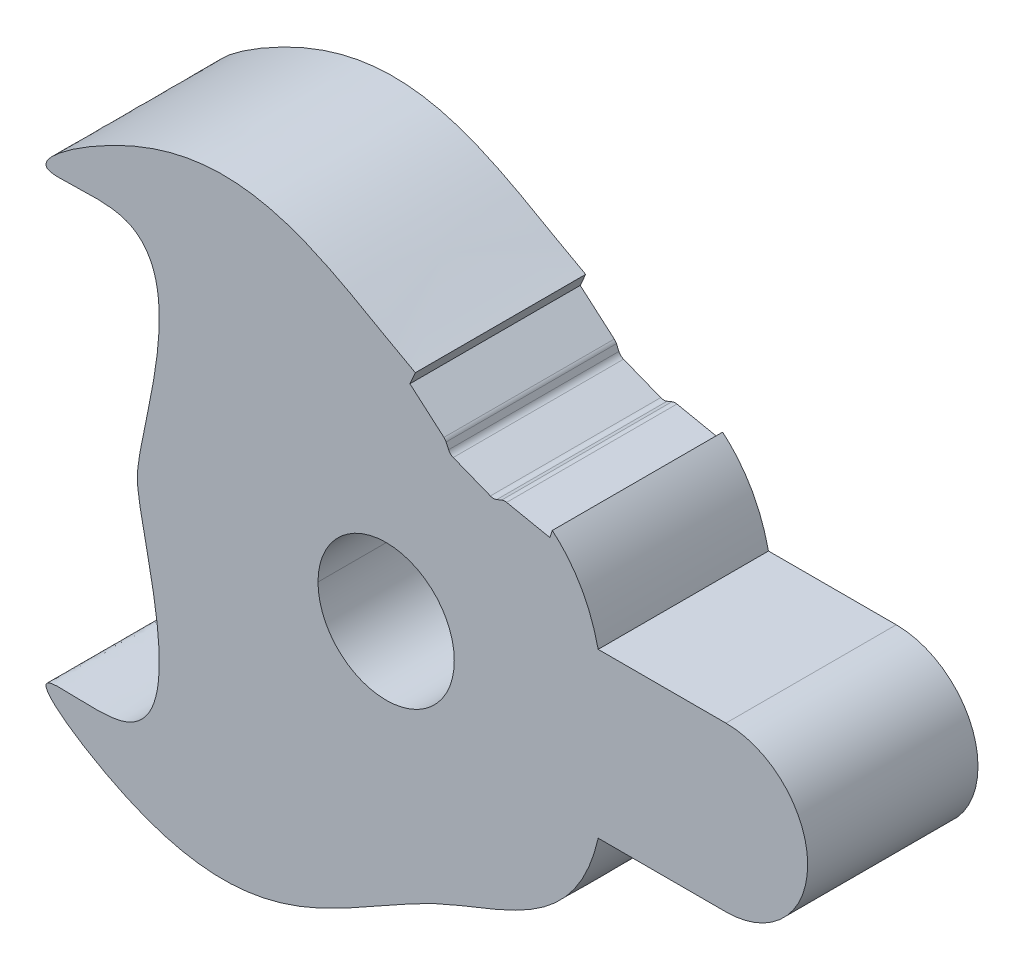
ISO-10303-21;
HEADER;
FILE_DESCRIPTION(('STEP AP214'),'2;1');
FILE_NAME('part.step','',(''),(''),'','','');
FILE_SCHEMA(('AUTOMOTIVE_DESIGN { 1 0 10303 214 1 1 1 1 }'));
ENDSEC;
DATA;
#1=APPLICATION_CONTEXT('core data for automotive mechanical design processes');
#2=APPLICATION_PROTOCOL_DEFINITION('international standard','automotive_design',2000,#1);
#3=PRODUCT_CONTEXT('',#1,'mechanical');
#4=PRODUCT('Part','Part','',(#3));
#5=PRODUCT_RELATED_PRODUCT_CATEGORY('part','',(#4));
#6=PRODUCT_DEFINITION_FORMATION('','',#4);
#7=PRODUCT_DEFINITION_CONTEXT('part definition',#1,'design');
#8=PRODUCT_DEFINITION('design','',#6,#7);
#9=PRODUCT_DEFINITION_SHAPE('','',#8);
#10=(LENGTH_UNIT() NAMED_UNIT(*) SI_UNIT(.MILLI.,.METRE.));
#11=(NAMED_UNIT(*) PLANE_ANGLE_UNIT() SI_UNIT($,.RADIAN.));
#12=(NAMED_UNIT(*) SI_UNIT($,.STERADIAN.) SOLID_ANGLE_UNIT());
#13=UNCERTAINTY_MEASURE_WITH_UNIT(LENGTH_MEASURE(1.E-05),#10,'distance_accuracy_value','');
#14=(GEOMETRIC_REPRESENTATION_CONTEXT(3) GLOBAL_UNCERTAINTY_ASSIGNED_CONTEXT((#13)) GLOBAL_UNIT_ASSIGNED_CONTEXT((#10,
#11,#12)) REPRESENTATION_CONTEXT('',''));
#15=CARTESIAN_POINT('',(0.,0.,0.));
#16=DIRECTION('',(0.,0.,1.));
#17=DIRECTION('',(1.,0.,0.));
#18=AXIS2_PLACEMENT_3D('',#15,#16,#17);
#19=CARTESIAN_POINT('',(42.41,9.6,10.));
#20=CARTESIAN_POINT('',(39.8586722441381,20.7760374434888,10.));
#21=CARTESIAN_POINT('',(18.660438136188,24.2000612318271,10.));
#22=CARTESIAN_POINT('',(0.622804196252919,43.5441166762142,10.));
#23=CARTESIAN_POINT('',(-27.8844791314099,24.1434182905529,10.));
#24=CARTESIAN_POINT('',(-2.35563850417925,29.3499905667288,10.));
#25=CARTESIAN_POINT('',(-11.8392778436634,4.89447238167406,10.));
#26=CARTESIAN_POINT('',(-11.6928477947035,0.,10.));
#27=B_SPLINE_CURVE_WITH_KNOTS('',3,(#19,#20,#21,#22,#23,#24,#25,#26),.UNSPECIFIED.,.F.,.F.,(4,1,
1,1,1,4),(0.,0.226821085199218,0.566812782418977,0.680043532454263,0.758970766590424,1.),.UNSPECIFIED.);
#28=DIRECTION('',(0.,0.,-1.));
#29=VECTOR('',#28,1.);
#30=SURFACE_OF_LINEAR_EXTRUSION('',#27,#29);
#31=CARTESIAN_POINT('',(42.41,9.6,-10.));
#32=CARTESIAN_POINT('',(39.8586722441381,20.7760374434888,-10.));
#33=CARTESIAN_POINT('',(18.660438136188,24.2000612318271,-10.));
#34=CARTESIAN_POINT('',(0.622804196252919,43.5441166762142,-10.));
#35=CARTESIAN_POINT('',(-27.8844791314099,24.1434182905529,-10.));
#36=CARTESIAN_POINT('',(-2.35563850417925,29.3499905667288,-10.));
#37=CARTESIAN_POINT('',(-11.8392778436634,4.89447238167406,-10.));
#38=CARTESIAN_POINT('',(-11.6928477947035,0.,-10.));
#39=B_SPLINE_CURVE_WITH_KNOTS('',3,(#31,#32,#33,#34,#35,#36,#37,#38),.UNSPECIFIED.,.F.,.F.,(4,1,
1,1,1,4),(0.,0.226821085199218,0.566812782418977,0.680043532454263,0.758970766590424,1.),.UNSPECIFIED.);
#40=CARTESIAN_POINT('',(42.41,9.6,-10.));
#41=VERTEX_POINT('',#40);
#42=CARTESIAN_POINT('',(37.0201671597787,18.9975069728334,-10.));
#43=VERTEX_POINT('',#42);
#44=EDGE_CURVE('E200',#41,#43,#39,.T.);
#45=ORIENTED_EDGE('',*,*,#44,.T.);
#46=DIRECTION('',(0.,0.,-1.));
#47=VECTOR('',#46,1.);
#48=CARTESIAN_POINT('',(37.0201671591372,18.997506970806,10.));
#49=LINE('',#48,#47);
#50=CARTESIAN_POINT('',(37.0201671597787,18.9975069728334,10.));
#51=VERTEX_POINT('',#50);
#52=EDGE_CURVE('E308',#43,#51,#49,.F.);
#53=ORIENTED_EDGE('',*,*,#52,.T.);
#54=CARTESIAN_POINT('',(42.41,9.6,10.));
#55=VERTEX_POINT('',#54);
#56=EDGE_CURVE('E351',#55,#51,#27,.T.);
#57=ORIENTED_EDGE('',*,*,#56,.F.);
#58=DIRECTION('',(0.,0.,-1.));
#59=VECTOR('',#58,1.);
#60=CARTESIAN_POINT('',(42.41,9.6,10.));
#61=LINE('',#60,#59);
#62=EDGE_CURVE('E218',#55,#41,#61,.T.);
#63=ORIENTED_EDGE('',*,*,#62,.T.);
#64=EDGE_LOOP('',(#45,#53,#57,#63));
#65=FACE_BOUND('',#64,.T.);
#66=ADVANCED_FACE('F39',(#65),#30,.F.);
#67=CARTESIAN_POINT('',(20.9399908582083,26.9987220677966,10.));
#68=VERTEX_POINT('',#67);
#69=CARTESIAN_POINT('',(-11.6928477947035,-2.53894882112157E-13,10.));
#70=VERTEX_POINT('',#69);
#71=EDGE_CURVE('E189',#68,#70,#27,.T.);
#72=ORIENTED_EDGE('',*,*,#71,.F.);
#73=DIRECTION('',(0.,0.,1.));
#74=VECTOR('',#73,1.);
#75=CARTESIAN_POINT('',(20.9399908582083,26.9987220677966,-10.));
#76=LINE('',#75,#74);
#77=CARTESIAN_POINT('',(20.9399908582083,26.9987220677966,-10.));
#78=VERTEX_POINT('',#77);
#79=EDGE_CURVE('E173',#78,#68,#76,.T.);
#80=ORIENTED_EDGE('',*,*,#79,.F.);
#81=CARTESIAN_POINT('',(-11.6928477947035,2.51030960387217E-13,-10.));
#82=VERTEX_POINT('',#81);
#83=EDGE_CURVE('E187',#78,#82,#39,.T.);
#84=ORIENTED_EDGE('',*,*,#83,.T.);
#85=DIRECTION('',(0.,0.,-1.));
#86=VECTOR('',#85,1.);
#87=CARTESIAN_POINT('',(-11.6928477947035,-2.53894882112157E-13,10.));
#88=LINE('',#87,#86);
#89=EDGE_CURVE('E230',#70,#82,#88,.T.);
#90=ORIENTED_EDGE('',*,*,#89,.F.);
#91=EDGE_LOOP('',(#72,#80,#84,#90));
#92=FACE_BOUND('',#91,.T.);
#93=ADVANCED_FACE('F183',(#92),#30,.F.);
#94=CARTESIAN_POINT('',(17.51,0.019999999999995,10.));
#95=DIRECTION('',(0.,0.,-1.));
#96=DIRECTION('',(-1.,0.,0.));
#97=AXIS2_PLACEMENT_3D('',#94,#95,#96);
#98=CYLINDRICAL_SURFACE('',#97,8.00000000000421);
#99=CARTESIAN_POINT('',(17.51,0.019999999999995,-10.));
#100=DIRECTION('',(0.,0.,-1.));
#101=DIRECTION('',(-1.,0.,0.));
#102=AXIS2_PLACEMENT_3D('',#99,#100,#101);
#103=CIRCLE('',#102,8.00000000000421);
#104=CARTESIAN_POINT('',(9.51002500003485,-2.51298279082076E-13,-10.));
#105=VERTEX_POINT('',#104);
#106=CARTESIAN_POINT('',(25.5099749999651,0.,-10.));
#107=VERTEX_POINT('',#106);
#108=EDGE_CURVE('E202',#105,#107,#103,.T.);
#109=ORIENTED_EDGE('',*,*,#108,.T.);
#110=DIRECTION('',(0.,0.,-1.));
#111=VECTOR('',#110,1.);
#112=CARTESIAN_POINT('',(25.5099749999651,0.,10.));
#113=LINE('',#112,#111);
#114=CARTESIAN_POINT('',(25.5099749999651,0.,10.));
#115=VERTEX_POINT('',#114);
#116=EDGE_CURVE('E221',#115,#107,#113,.T.);
#117=ORIENTED_EDGE('',*,*,#116,.F.);
#118=CARTESIAN_POINT('',(17.51,0.019999999999995,10.));
#119=DIRECTION('',(0.,0.,-1.));
#120=DIRECTION('',(-1.,0.,0.));
#121=AXIS2_PLACEMENT_3D('',#118,#119,#120);
#122=CIRCLE('',#121,8.00000000000421);
#123=CARTESIAN_POINT('',(9.51002500003485,-2.51298279082076E-13,10.));
#124=VERTEX_POINT('',#123);
#125=EDGE_CURVE('E359',#124,#115,#122,.T.);
#126=ORIENTED_EDGE('',*,*,#125,.F.);
#127=DIRECTION('',(0.,0.,-1.));
#128=VECTOR('',#127,1.);
#129=CARTESIAN_POINT('',(9.51002500003485,-2.51298279082076E-13,10.));
#130=LINE('',#129,#128);
#131=EDGE_CURVE('E227',#124,#105,#130,.T.);
#132=ORIENTED_EDGE('',*,*,#131,.T.);
#133=EDGE_LOOP('',(#109,#117,#126,#132));
#134=FACE_BOUND('',#133,.T.);
#135=ADVANCED_FACE('F343',(#134),#98,.F.);
#136=CARTESIAN_POINT('',(57.4100000000042,0.,10.));
#137=DIRECTION('',(0.,0.,-1.));
#138=DIRECTION('',(-1.,0.,0.));
#139=AXIS2_PLACEMENT_3D('',#136,#137,#138);
#140=CYLINDRICAL_SURFACE('',#139,9.6);
#141=DIRECTION('',(0.,0.,-1.));
#142=VECTOR('',#141,1.);
#143=CARTESIAN_POINT('',(57.4100000000042,9.6,10.));
#144=LINE('',#143,#142);
#145=CARTESIAN_POINT('',(57.4100000000042,9.6,10.));
#146=VERTEX_POINT('',#145);
#147=CARTESIAN_POINT('',(57.4100000000042,9.6,-10.));
#148=VERTEX_POINT('',#147);
#149=EDGE_CURVE('E222',#146,#148,#144,.T.);
#150=ORIENTED_EDGE('',*,*,#149,.F.);
#151=CARTESIAN_POINT('',(57.4100000000042,0.,10.));
#152=DIRECTION('',(0.,0.,1.));
#153=DIRECTION('',(1.,0.,0.));
#154=AXIS2_PLACEMENT_3D('',#151,#152,#153);
#155=CIRCLE('',#154,9.6);
#156=CARTESIAN_POINT('',(57.4100000000042,-9.59999999999998,10.));
#157=VERTEX_POINT('',#156);
#158=EDGE_CURVE('E362',#157,#146,#155,.T.);
#159=ORIENTED_EDGE('',*,*,#158,.F.);
#160=DIRECTION('',(0.,0.,-1.));
#161=VECTOR('',#160,1.);
#162=CARTESIAN_POINT('',(57.4100000000042,-9.59999999999998,10.));
#163=LINE('',#162,#161);
#164=CARTESIAN_POINT('',(57.4100000000042,-9.59999999999998,-10.));
#165=VERTEX_POINT('',#164);
#166=EDGE_CURVE('E204',#157,#165,#163,.T.);
#167=ORIENTED_EDGE('',*,*,#166,.T.);
#168=CARTESIAN_POINT('',(57.4100000000042,0.,-10.));
#169=DIRECTION('',(0.,0.,1.));
#170=DIRECTION('',(1.,0.,0.));
#171=AXIS2_PLACEMENT_3D('',#168,#169,#170);
#172=CIRCLE('',#171,9.6);
#173=EDGE_CURVE('E213',#165,#148,#172,.T.);
#174=ORIENTED_EDGE('',*,*,#173,.T.);
#175=EDGE_LOOP('',(#150,#159,#167,#174));
#176=FACE_BOUND('',#175,.T.);
#177=ADVANCED_FACE('F338',(#176),#140,.T.);
#178=CARTESIAN_POINT('',(42.41,9.6,10.));
#179=DIRECTION('',(0.,-1.,0.));
#180=DIRECTION('',(0.,0.,-1.));
#181=AXIS2_PLACEMENT_3D('',#178,#179,#180);
#182=PLANE('',#181);
#183=DIRECTION('',(-1.,0.,0.));
#184=VECTOR('',#183,1.);
#185=CARTESIAN_POINT('',(42.41,9.6,-10.));
#186=LINE('',#185,#184);
#187=EDGE_CURVE('E216',#148,#41,#186,.T.);
#188=ORIENTED_EDGE('',*,*,#187,.T.);
#189=ORIENTED_EDGE('',*,*,#62,.F.);
#190=DIRECTION('',(-1.,0.,0.));
#191=VECTOR('',#190,1.);
#192=CARTESIAN_POINT('',(42.41,9.6,10.));
#193=LINE('',#192,#191);
#194=EDGE_CURVE('E206',#146,#55,#193,.T.);
#195=ORIENTED_EDGE('',*,*,#194,.F.);
#196=ORIENTED_EDGE('',*,*,#149,.T.);
#197=EDGE_LOOP('',(#188,#189,#195,#196));
#198=FACE_BOUND('',#197,.T.);
#199=ADVANCED_FACE('F331',(#198),#182,.F.);
#200=CARTESIAN_POINT('',(-3.63672949234743,35.740900786687,10.));
#201=DIRECTION('',(0.,0.,1.));
#202=DIRECTION('',(1.,0.,0.));
#203=AXIS2_PLACEMENT_3D('',#200,#201,#202);
#204=PLANE('',#203);
#205=DIRECTION('',(0.979721760093609,-0.200362852842241,0.));
#206=VECTOR('',#205,1.);
#207=CARTESIAN_POINT('',(36.7456690146438,18.1299826347318,10.));
#208=LINE('',#207,#206);
#209=CARTESIAN_POINT('',(31.6567303354823,19.1707212538257,10.));
#210=VERTEX_POINT('',#209);
#211=CARTESIAN_POINT('',(36.7456690146438,18.1299826347318,10.));
#212=VERTEX_POINT('',#211);
#213=EDGE_CURVE('E305',#210,#212,#208,.T.);
#214=ORIENTED_EDGE('',*,*,#213,.F.);
#215=CARTESIAN_POINT('',(31.45636748264,18.1909994937321,10.));
#216=DIRECTION('',(0.,0.,1.));
#217=DIRECTION('',(1.,0.,0.));
#218=AXIS2_PLACEMENT_3D('',#215,#216,#217);
#219=CIRCLE('',#218,1.);
#220=CARTESIAN_POINT('',(31.0746223601703,19.1152671289279,10.));
#221=VERTEX_POINT('',#220);
#222=EDGE_CURVE('E236',#210,#221,#219,.T.);
#223=ORIENTED_EDGE('',*,*,#222,.T.);
#224=DIRECTION('',(0.924267635195892,0.381745122469683,0.));
#225=VECTOR('',#224,1.);
#226=CARTESIAN_POINT('',(31.357199334129,19.2319783253641,10.));
#227=LINE('',#226,#225);
#228=CARTESIAN_POINT('',(30.5008405391083,18.8782812135812,10.));
#229=VERTEX_POINT('',#228);
#230=EDGE_CURVE('E299',#229,#221,#227,.T.);
#231=ORIENTED_EDGE('',*,*,#230,.F.);
#232=CARTESIAN_POINT('',(30.1190954166386,19.8025488487771,10.));
#233=DIRECTION('',(0.,0.,1.));
#234=DIRECTION('',(1.,0.,0.));
#235=AXIS2_PLACEMENT_3D('',#232,#233,#234);
#236=CIRCLE('',#235,1.);
#237=CARTESIAN_POINT('',(29.751649627483,18.8725039079104,10.));
#238=VERTEX_POINT('',#237);
#239=EDGE_CURVE('E257',#229,#238,#236,.F.);
#240=ORIENTED_EDGE('',*,*,#239,.T.);
#241=DIRECTION('',(0.930044940866749,-0.367445789155577,0.));
#242=VECTOR('',#241,1.);
#243=CARTESIAN_POINT('',(30.1274121747985,18.7240461725188,10.));
#244=LINE('',#243,#242);
#245=CARTESIAN_POINT('',(25.3879275473468,20.596540277483,10.));
#246=VERTEX_POINT('',#245);
#247=EDGE_CURVE('E266',#246,#238,#244,.T.);
#248=ORIENTED_EDGE('',*,*,#247,.F.);
#249=CARTESIAN_POINT('',(25.7553733365024,21.5265852183497,10.));
#250=DIRECTION('',(0.,0.,1.));
#251=DIRECTION('',(1.,0.,0.));
#252=AXIS2_PLACEMENT_3D('',#249,#250,#251);
#253=CIRCLE('',#252,1.);
#254=CARTESIAN_POINT('',(24.8449914528198,21.1128161694075,10.));
#255=VERTEX_POINT('',#254);
#256=EDGE_CURVE('E50',#246,#255,#253,.F.);
#257=ORIENTED_EDGE('',*,*,#256,.T.);
#258=DIRECTION('',(0.413769048942224,-0.910381883682583,0.));
#259=VECTOR('',#258,1.);
#260=CARTESIAN_POINT('',(25.0121650000313,20.7449980128745,10.));
#261=LINE('',#260,#259);
#262=CARTESIAN_POINT('',(24.5522557143188,21.7568984508614,10.));
#263=VERTEX_POINT('',#262);
#264=EDGE_CURVE('E270',#263,#255,#261,.T.);
#265=ORIENTED_EDGE('',*,*,#264,.F.);
#266=CARTESIAN_POINT('',(23.6418738306363,21.3431294019192,10.));
#267=DIRECTION('',(0.,0.,1.));
#268=DIRECTION('',(1.,0.,0.));
#269=AXIS2_PLACEMENT_3D('',#266,#267,#268);
#270=CIRCLE('',#269,1.);
#271=CARTESIAN_POINT('',(24.295930740267,22.0995747462531,10.));
#272=VERTEX_POINT('',#271);
#273=EDGE_CURVE('E234',#263,#272,#270,.T.);
#274=ORIENTED_EDGE('',*,*,#273,.T.);
#275=DIRECTION('',(0.756445344333846,-0.654056909630691,0.));
#276=VECTOR('',#275,1.);
#277=CARTESIAN_POINT('',(24.4616233128179,21.956309442602,10.));
#278=LINE('',#277,#276);
#279=CARTESIAN_POINT('',(20.3011739189817,25.5536224455708,10.));
#280=VERTEX_POINT('',#279);
#281=EDGE_CURVE('E280',#280,#272,#278,.T.);
#282=ORIENTED_EDGE('',*,*,#281,.F.);
#283=DIRECTION('',(-0.404314518497846,-0.914620014066965,0.));
#284=VECTOR('',#283,1.);
#285=CARTESIAN_POINT('',(20.3011739189817,25.5536224455708,10.));
#286=LINE('',#285,#284);
#287=EDGE_CURVE('E295',#68,#280,#286,.T.);
#288=ORIENTED_EDGE('',*,*,#287,.F.);
#289=ORIENTED_EDGE('',*,*,#71,.T.);
#290=CARTESIAN_POINT('',(42.41,-9.59999999999999,10.));
#291=CARTESIAN_POINT('',(39.8586722441381,-20.7760374434888,10.));
#292=CARTESIAN_POINT('',(18.660438136188,-24.2000612318271,10.));
#293=CARTESIAN_POINT('',(0.62280419625293,-43.5441166762142,10.));
#294=CARTESIAN_POINT('',(-27.8844791314099,-24.1434182905529,10.));
#295=CARTESIAN_POINT('',(-2.35563850417924,-29.3499905667288,10.));
#296=CARTESIAN_POINT('',(-11.8392778436634,-4.89447238167406,10.));
#297=CARTESIAN_POINT('',(-11.6928477947035,0.,10.));
#298=B_SPLINE_CURVE_WITH_KNOTS('',3,(#290,#291,#292,#293,#294,#295,#296,#297),.UNSPECIFIED.,.F.,
.F.,(4,1,1,1,1,4),(0.,0.226821085199218,0.566812782418977,0.680043532454263,0.758970766590424,
1.),.UNSPECIFIED.);
#299=CARTESIAN_POINT('',(42.41,-9.59999999999999,10.));
#300=VERTEX_POINT('',#299);
#301=EDGE_CURVE('E315',#300,#70,#298,.T.);
#302=ORIENTED_EDGE('',*,*,#301,.F.);
#303=DIRECTION('',(-1.,0.,0.));
#304=VECTOR('',#303,1.);
#305=CARTESIAN_POINT('',(42.41,-9.59999999999999,10.));
#306=LINE('',#305,#304);
#307=EDGE_CURVE('E319',#157,#300,#306,.T.);
#308=ORIENTED_EDGE('',*,*,#307,.F.);
#309=ORIENTED_EDGE('',*,*,#158,.T.);
#310=ORIENTED_EDGE('',*,*,#194,.T.);
#311=ORIENTED_EDGE('',*,*,#56,.T.);
#312=DIRECTION('',(0.301674054182524,0.953411120678315,0.));
#313=VECTOR('',#312,1.);
#314=CARTESIAN_POINT('',(37.5999908582083,20.8299826347318,10.));
#315=LINE('',#314,#313);
#316=EDGE_CURVE('E179',#212,#51,#315,.T.);
#317=ORIENTED_EDGE('',*,*,#316,.F.);
#318=EDGE_LOOP('',(#214,#223,#231,#240,#248,#257,#265,#274,#282,#288,#289,#302,#308,#309,#310,
#311,#317));
#319=FACE_BOUND('',#318,.T.);
#320=ORIENTED_EDGE('',*,*,#125,.T.);
#321=CARTESIAN_POINT('',(17.51,-0.0199999999999907,10.));
#322=DIRECTION('',(0.,0.,1.));
#323=DIRECTION('',(-1.,0.,0.));
#324=AXIS2_PLACEMENT_3D('',#321,#322,#323);
#325=CIRCLE('',#324,8.00000000000421);
#326=EDGE_CURVE('E513',#124,#115,#325,.T.);
#327=ORIENTED_EDGE('',*,*,#326,.F.);
#328=EDGE_LOOP('',(#320,#327));
#329=FACE_BOUND('',#328,.T.);
#330=ADVANCED_FACE('F267',(#319,#329),#204,.T.);
#331=CARTESIAN_POINT('',(-3.63672949234743,35.740900786687,-10.));
#332=DIRECTION('',(0.,0.,1.));
#333=DIRECTION('',(1.,0.,0.));
#334=AXIS2_PLACEMENT_3D('',#331,#332,#333);
#335=PLANE('',#334);
#336=ORIENTED_EDGE('',*,*,#108,.F.);
#337=CARTESIAN_POINT('',(17.51,-0.0199999999999907,-10.));
#338=DIRECTION('',(0.,0.,1.));
#339=DIRECTION('',(-1.,0.,0.));
#340=AXIS2_PLACEMENT_3D('',#337,#338,#339);
#341=CIRCLE('',#340,8.00000000000421);
#342=EDGE_CURVE('E316',#105,#107,#341,.T.);
#343=ORIENTED_EDGE('',*,*,#342,.T.);
#344=EDGE_LOOP('',(#336,#343));
#345=FACE_BOUND('',#344,.T.);
#346=DIRECTION('',(0.924267635195892,0.381745122469683,0.));
#347=VECTOR('',#346,1.);
#348=CARTESIAN_POINT('',(31.357199334129,19.2319783253641,-10.));
#349=LINE('',#348,#347);
#350=CARTESIAN_POINT('',(30.5008405391083,18.8782812135812,-10.));
#351=VERTEX_POINT('',#350);
#352=CARTESIAN_POINT('',(31.0746223601703,19.1152671289279,-10.));
#353=VERTEX_POINT('',#352);
#354=EDGE_CURVE('E283',#351,#353,#349,.T.);
#355=ORIENTED_EDGE('',*,*,#354,.T.);
#356=CARTESIAN_POINT('',(31.45636748264,18.1909994937321,-10.));
#357=DIRECTION('',(0.,0.,1.));
#358=DIRECTION('',(1.,0.,0.));
#359=AXIS2_PLACEMENT_3D('',#356,#357,#358);
#360=CIRCLE('',#359,1.);
#361=CARTESIAN_POINT('',(31.6567303354823,19.1707212538257,-10.));
#362=VERTEX_POINT('',#361);
#363=EDGE_CURVE('E244',#353,#362,#360,.F.);
#364=ORIENTED_EDGE('',*,*,#363,.T.);
#365=DIRECTION('',(0.979721760093609,-0.200362852842241,0.));
#366=VECTOR('',#365,1.);
#367=CARTESIAN_POINT('',(36.7456690146438,18.1299826347318,-10.));
#368=LINE('',#367,#366);
#369=CARTESIAN_POINT('',(36.7456690146438,18.1299826347318,-10.));
#370=VERTEX_POINT('',#369);
#371=EDGE_CURVE('E287',#362,#370,#368,.T.);
#372=ORIENTED_EDGE('',*,*,#371,.T.);
#373=DIRECTION('',(0.301674054182524,0.953411120678315,0.));
#374=VECTOR('',#373,1.);
#375=CARTESIAN_POINT('',(37.5999908582083,20.8299826347318,-10.));
#376=LINE('',#375,#374);
#377=EDGE_CURVE('E186',#370,#43,#376,.T.);
#378=ORIENTED_EDGE('',*,*,#377,.T.);
#379=ORIENTED_EDGE('',*,*,#44,.F.);
#380=ORIENTED_EDGE('',*,*,#187,.F.);
#381=ORIENTED_EDGE('',*,*,#173,.F.);
#382=DIRECTION('',(-1.,0.,0.));
#383=VECTOR('',#382,1.);
#384=CARTESIAN_POINT('',(42.41,-9.59999999999999,-10.));
#385=LINE('',#384,#383);
#386=CARTESIAN_POINT('',(42.41,-9.59999999999999,-10.));
#387=VERTEX_POINT('',#386);
#388=EDGE_CURVE('E514',#165,#387,#385,.T.);
#389=ORIENTED_EDGE('',*,*,#388,.T.);
#390=CARTESIAN_POINT('',(42.41,-9.59999999999999,-10.));
#391=CARTESIAN_POINT('',(39.8586722441381,-20.7760374434888,-10.));
#392=CARTESIAN_POINT('',(18.660438136188,-24.2000612318271,-10.));
#393=CARTESIAN_POINT('',(0.62280419625293,-43.5441166762142,-10.));
#394=CARTESIAN_POINT('',(-27.8844791314099,-24.1434182905529,-10.));
#395=CARTESIAN_POINT('',(-2.35563850417924,-29.3499905667288,-10.));
#396=CARTESIAN_POINT('',(-11.8392778436634,-4.89447238167406,-10.));
#397=CARTESIAN_POINT('',(-11.6928477947035,0.,-10.));
#398=B_SPLINE_CURVE_WITH_KNOTS('',3,(#390,#391,#392,#393,#394,#395,#396,#397),.UNSPECIFIED.,.F.,
.F.,(4,1,1,1,1,4),(0.,0.226821085199218,0.566812782418977,0.680043532454263,0.758970766590424,
1.),.UNSPECIFIED.);
#399=EDGE_CURVE('E196',#387,#82,#398,.T.);
#400=ORIENTED_EDGE('',*,*,#399,.T.);
#401=ORIENTED_EDGE('',*,*,#83,.F.);
#402=DIRECTION('',(-0.404314518497846,-0.914620014066965,0.));
#403=VECTOR('',#402,1.);
#404=CARTESIAN_POINT('',(20.3011739189817,25.5536224455708,-10.));
#405=LINE('',#404,#403);
#406=CARTESIAN_POINT('',(20.3011739189817,25.5536224455708,-10.));
#407=VERTEX_POINT('',#406);
#408=EDGE_CURVE('E169',#78,#407,#405,.T.);
#409=ORIENTED_EDGE('',*,*,#408,.T.);
#410=DIRECTION('',(0.756445344333846,-0.654056909630691,0.));
#411=VECTOR('',#410,1.);
#412=CARTESIAN_POINT('',(24.4616233128179,21.956309442602,-10.));
#413=LINE('',#412,#411);
#414=CARTESIAN_POINT('',(24.295930740267,22.0995747462531,-10.));
#415=VERTEX_POINT('',#414);
#416=EDGE_CURVE('E177',#407,#415,#413,.T.);
#417=ORIENTED_EDGE('',*,*,#416,.T.);
#418=CARTESIAN_POINT('',(23.6418738306363,21.3431294019192,-10.));
#419=DIRECTION('',(0.,0.,1.));
#420=DIRECTION('',(1.,0.,0.));
#421=AXIS2_PLACEMENT_3D('',#418,#419,#420);
#422=CIRCLE('',#421,1.);
#423=CARTESIAN_POINT('',(24.5522557143188,21.7568984508614,-10.));
#424=VERTEX_POINT('',#423);
#425=EDGE_CURVE('E243',#415,#424,#422,.F.);
#426=ORIENTED_EDGE('',*,*,#425,.T.);
#427=DIRECTION('',(0.413769048942224,-0.910381883682583,0.));
#428=VECTOR('',#427,1.);
#429=CARTESIAN_POINT('',(25.0121650000313,20.7449980128745,-10.));
#430=LINE('',#429,#428);
#431=CARTESIAN_POINT('',(24.8449914528198,21.1128161694075,-10.));
#432=VERTEX_POINT('',#431);
#433=EDGE_CURVE('E282',#424,#432,#430,.T.);
#434=ORIENTED_EDGE('',*,*,#433,.T.);
#435=CARTESIAN_POINT('',(25.7553733365024,21.5265852183497,-10.));
#436=DIRECTION('',(0.,0.,1.));
#437=DIRECTION('',(1.,0.,0.));
#438=AXIS2_PLACEMENT_3D('',#435,#436,#437);
#439=CIRCLE('',#438,1.);
#440=CARTESIAN_POINT('',(25.3879275473468,20.596540277483,-10.));
#441=VERTEX_POINT('',#440);
#442=EDGE_CURVE('E11',#432,#441,#439,.T.);
#443=ORIENTED_EDGE('',*,*,#442,.T.);
#444=DIRECTION('',(0.930044940866749,-0.367445789155577,0.));
#445=VECTOR('',#444,1.);
#446=CARTESIAN_POINT('',(30.1274121747985,18.7240461725188,-10.));
#447=LINE('',#446,#445);
#448=CARTESIAN_POINT('',(29.751649627483,18.8725039079104,-10.));
#449=VERTEX_POINT('',#448);
#450=EDGE_CURVE('E281',#441,#449,#447,.T.);
#451=ORIENTED_EDGE('',*,*,#450,.T.);
#452=CARTESIAN_POINT('',(30.1190954166386,19.8025488487771,-10.));
#453=DIRECTION('',(0.,0.,1.));
#454=DIRECTION('',(1.,0.,0.));
#455=AXIS2_PLACEMENT_3D('',#452,#453,#454);
#456=CIRCLE('',#455,1.);
#457=EDGE_CURVE('E259',#449,#351,#456,.T.);
#458=ORIENTED_EDGE('',*,*,#457,.T.);
#459=EDGE_LOOP('',(#355,#364,#372,#378,#379,#380,#381,#389,#400,#401,#409,#417,#426,#434,#443,
#451,#458));
#460=FACE_BOUND('',#459,.T.);
#461=ADVANCED_FACE('F192',(#345,#460),#335,.F.);
#462=DIRECTION('',(0.,0.,-1.));
#463=VECTOR('',#462,1.);
#464=SURFACE_OF_LINEAR_EXTRUSION('',#298,#463);
#465=ORIENTED_EDGE('',*,*,#399,.F.);
#466=DIRECTION('',(0.,0.,-1.));
#467=VECTOR('',#466,1.);
#468=CARTESIAN_POINT('',(42.41,-9.59999999999999,10.));
#469=LINE('',#468,#467);
#470=EDGE_CURVE('E198',#300,#387,#469,.T.);
#471=ORIENTED_EDGE('',*,*,#470,.F.);
#472=ORIENTED_EDGE('',*,*,#301,.T.);
#473=ORIENTED_EDGE('',*,*,#89,.T.);
#474=EDGE_LOOP('',(#465,#471,#472,#473));
#475=FACE_BOUND('',#474,.T.);
#476=ADVANCED_FACE('F324',(#475),#464,.T.);
#477=CARTESIAN_POINT('',(42.41,-9.59999999999999,10.));
#478=DIRECTION('',(0.,-1.,0.));
#479=DIRECTION('',(1.,0.,0.));
#480=AXIS2_PLACEMENT_3D('',#477,#478,#479);
#481=PLANE('',#480);
#482=ORIENTED_EDGE('',*,*,#388,.F.);
#483=ORIENTED_EDGE('',*,*,#166,.F.);
#484=ORIENTED_EDGE('',*,*,#307,.T.);
#485=ORIENTED_EDGE('',*,*,#470,.T.);
#486=EDGE_LOOP('',(#482,#483,#484,#485));
#487=FACE_BOUND('',#486,.T.);
#488=ADVANCED_FACE('F327',(#487),#481,.T.);
#489=CARTESIAN_POINT('',(17.51,-0.0199999999999907,10.));
#490=DIRECTION('',(0.,0.,-1.));
#491=DIRECTION('',(-1.,0.,0.));
#492=AXIS2_PLACEMENT_3D('',#489,#490,#491);
#493=CYLINDRICAL_SURFACE('',#492,8.00000000000421);
#494=ORIENTED_EDGE('',*,*,#342,.F.);
#495=ORIENTED_EDGE('',*,*,#131,.F.);
#496=ORIENTED_EDGE('',*,*,#326,.T.);
#497=ORIENTED_EDGE('',*,*,#116,.T.);
#498=EDGE_LOOP('',(#494,#495,#496,#497));
#499=FACE_BOUND('',#498,.T.);
#500=ADVANCED_FACE('F408',(#499),#493,.F.);
#501=CARTESIAN_POINT('',(37.5999908582083,20.8299826347318,-10.));
#502=DIRECTION('',(0.953411120678315,-0.301674054182524,0.));
#503=DIRECTION('',(0.301674054182524,0.953411120678315,0.));
#504=AXIS2_PLACEMENT_3D('',#501,#502,#503);
#505=PLANE('',#504);
#506=ORIENTED_EDGE('',*,*,#377,.F.);
#507=DIRECTION('',(0.,0.,1.));
#508=VECTOR('',#507,1.);
#509=CARTESIAN_POINT('',(36.7456690146438,18.1299826347318,-10.));
#510=LINE('',#509,#508);
#511=EDGE_CURVE('E304',#370,#212,#510,.T.);
#512=ORIENTED_EDGE('',*,*,#511,.T.);
#513=ORIENTED_EDGE('',*,*,#316,.T.);
#514=ORIENTED_EDGE('',*,*,#52,.F.);
#515=EDGE_LOOP('',(#506,#512,#513,#514));
#516=FACE_BOUND('',#515,.T.);
#517=ADVANCED_FACE('F380',(#516),#505,.F.);
#518=CARTESIAN_POINT('',(36.7456690146438,18.1299826347318,-10.));
#519=DIRECTION('',(-0.200362852842241,-0.979721760093609,0.));
#520=DIRECTION('',(0.979721760093609,-0.200362852842241,0.));
#521=AXIS2_PLACEMENT_3D('',#518,#519,#520);
#522=PLANE('',#521);
#523=ORIENTED_EDGE('',*,*,#371,.F.);
#524=DIRECTION('',(0.,0.,1.));
#525=VECTOR('',#524,1.);
#526=CARTESIAN_POINT('',(31.6567303354823,19.1707212538257,-10.));
#527=LINE('',#526,#525);
#528=EDGE_CURVE('E233',#362,#210,#527,.T.);
#529=ORIENTED_EDGE('',*,*,#528,.T.);
#530=ORIENTED_EDGE('',*,*,#213,.T.);
#531=ORIENTED_EDGE('',*,*,#511,.F.);
#532=EDGE_LOOP('',(#523,#529,#530,#531));
#533=FACE_BOUND('',#532,.T.);
#534=ADVANCED_FACE('F384',(#533),#522,.F.);
#535=CARTESIAN_POINT('',(31.357199334129,19.2319783253641,-10.));
#536=DIRECTION('',(0.381745122469683,-0.924267635195892,0.));
#537=DIRECTION('',(0.924267635195892,0.381745122469683,0.));
#538=AXIS2_PLACEMENT_3D('',#535,#536,#537);
#539=PLANE('',#538);
#540=ORIENTED_EDGE('',*,*,#230,.T.);
#541=DIRECTION('',(0.,0.,1.));
#542=VECTOR('',#541,1.);
#543=CARTESIAN_POINT('',(31.0746223601703,19.1152671289279,-10.));
#544=LINE('',#543,#542);
#545=EDGE_CURVE('E241',#221,#353,#544,.F.);
#546=ORIENTED_EDGE('',*,*,#545,.T.);
#547=ORIENTED_EDGE('',*,*,#354,.F.);
#548=DIRECTION('',(0.,0.,1.));
#549=VECTOR('',#548,1.);
#550=CARTESIAN_POINT('',(30.5008405391083,18.8782812135812,10.));
#551=LINE('',#550,#549);
#552=EDGE_CURVE('E238',#351,#229,#551,.T.);
#553=ORIENTED_EDGE('',*,*,#552,.T.);
#554=EDGE_LOOP('',(#540,#546,#547,#553));
#555=FACE_BOUND('',#554,.T.);
#556=ADVANCED_FACE('F387',(#555),#539,.F.);
#557=CARTESIAN_POINT('',(30.1274121747985,18.7240461725188,-10.));
#558=DIRECTION('',(-0.367445789155577,-0.930044940866749,0.));
#559=DIRECTION('',(0.930044940866749,-0.367445789155577,0.));
#560=AXIS2_PLACEMENT_3D('',#557,#558,#559);
#561=PLANE('',#560);
#562=ORIENTED_EDGE('',*,*,#247,.T.);
#563=DIRECTION('',(0.,0.,1.));
#564=VECTOR('',#563,1.);
#565=CARTESIAN_POINT('',(29.751649627483,18.8725039079104,-10.));
#566=LINE('',#565,#564);
#567=EDGE_CURVE('E53',#238,#449,#566,.F.);
#568=ORIENTED_EDGE('',*,*,#567,.T.);
#569=ORIENTED_EDGE('',*,*,#450,.F.);
#570=DIRECTION('',(0.,0.,1.));
#571=VECTOR('',#570,1.);
#572=CARTESIAN_POINT('',(25.3879275473468,20.596540277483,10.));
#573=LINE('',#572,#571);
#574=EDGE_CURVE('E250',#441,#246,#573,.T.);
#575=ORIENTED_EDGE('',*,*,#574,.T.);
#576=EDGE_LOOP('',(#562,#568,#569,#575));
#577=FACE_BOUND('',#576,.T.);
#578=ADVANCED_FACE('F279',(#577),#561,.F.);
#579=CARTESIAN_POINT('',(25.0121650000313,20.7449980128745,-10.));
#580=DIRECTION('',(-0.910381883682583,-0.413769048942224,0.));
#581=DIRECTION('',(0.413769048942224,-0.910381883682583,0.));
#582=AXIS2_PLACEMENT_3D('',#579,#580,#581);
#583=PLANE('',#582);
#584=ORIENTED_EDGE('',*,*,#264,.T.);
#585=DIRECTION('',(0.,0.,1.));
#586=VECTOR('',#585,1.);
#587=CARTESIAN_POINT('',(24.8449914528198,21.1128161694075,-10.));
#588=LINE('',#587,#586);
#589=EDGE_CURVE('E251',#255,#432,#588,.F.);
#590=ORIENTED_EDGE('',*,*,#589,.T.);
#591=ORIENTED_EDGE('',*,*,#433,.F.);
#592=DIRECTION('',(0.,0.,1.));
#593=VECTOR('',#592,1.);
#594=CARTESIAN_POINT('',(24.5522557143188,21.7568984508614,-10.));
#595=LINE('',#594,#593);
#596=EDGE_CURVE('E252',#424,#263,#595,.T.);
#597=ORIENTED_EDGE('',*,*,#596,.T.);
#598=EDGE_LOOP('',(#584,#590,#591,#597));
#599=FACE_BOUND('',#598,.T.);
#600=ADVANCED_FACE('F274',(#599),#583,.F.);
#601=CARTESIAN_POINT('',(24.4616233128179,21.956309442602,-10.));
#602=DIRECTION('',(-0.654056909630691,-0.756445344333846,0.));
#603=DIRECTION('',(0.756445344333846,-0.654056909630691,0.));
#604=AXIS2_PLACEMENT_3D('',#601,#602,#603);
#605=PLANE('',#604);
#606=ORIENTED_EDGE('',*,*,#281,.T.);
#607=DIRECTION('',(0.,0.,1.));
#608=VECTOR('',#607,1.);
#609=CARTESIAN_POINT('',(24.295930740267,22.0995747462531,-10.));
#610=LINE('',#609,#608);
#611=EDGE_CURVE('E256',#272,#415,#610,.F.);
#612=ORIENTED_EDGE('',*,*,#611,.T.);
#613=ORIENTED_EDGE('',*,*,#416,.F.);
#614=DIRECTION('',(0.,0.,1.));
#615=VECTOR('',#614,1.);
#616=CARTESIAN_POINT('',(20.3011739189817,25.5536224455708,-10.));
#617=LINE('',#616,#615);
#618=EDGE_CURVE('E174',#407,#280,#617,.T.);
#619=ORIENTED_EDGE('',*,*,#618,.T.);
#620=EDGE_LOOP('',(#606,#612,#613,#619));
#621=FACE_BOUND('',#620,.T.);
#622=ADVANCED_FACE('F396',(#621),#605,.F.);
#623=CARTESIAN_POINT('',(20.3011739189817,25.5536224455708,-10.));
#624=DIRECTION('',(-0.914620014066965,0.404314518497846,0.));
#625=DIRECTION('',(-0.404314518497846,-0.914620014066965,0.));
#626=AXIS2_PLACEMENT_3D('',#623,#624,#625);
#627=PLANE('',#626);
#628=ORIENTED_EDGE('',*,*,#287,.T.);
#629=ORIENTED_EDGE('',*,*,#618,.F.);
#630=ORIENTED_EDGE('',*,*,#408,.F.);
#631=ORIENTED_EDGE('',*,*,#79,.T.);
#632=EDGE_LOOP('',(#628,#629,#630,#631));
#633=FACE_BOUND('',#632,.T.);
#634=ADVANCED_FACE('F175',(#633),#627,.F.);
#635=CARTESIAN_POINT('',(31.45636748264,18.1909994937321,-10.));
#636=DIRECTION('',(0.,0.,1.));
#637=DIRECTION('',(1.,0.,0.));
#638=AXIS2_PLACEMENT_3D('',#635,#636,#637);
#639=CYLINDRICAL_SURFACE('',#638,1.);
#640=ORIENTED_EDGE('',*,*,#363,.F.);
#641=ORIENTED_EDGE('',*,*,#545,.F.);
#642=ORIENTED_EDGE('',*,*,#222,.F.);
#643=ORIENTED_EDGE('',*,*,#528,.F.);
#644=EDGE_LOOP('',(#640,#641,#642,#643));
#645=FACE_BOUND('',#644,.T.);
#646=ADVANCED_FACE('F354',(#645),#639,.T.);
#647=CARTESIAN_POINT('',(30.1190954166386,19.8025488487771,-10.));
#648=DIRECTION('',(0.,0.,-1.));
#649=DIRECTION('',(-1.,0.,0.));
#650=AXIS2_PLACEMENT_3D('',#647,#648,#649);
#651=CYLINDRICAL_SURFACE('',#650,1.);
#652=ORIENTED_EDGE('',*,*,#457,.F.);
#653=ORIENTED_EDGE('',*,*,#567,.F.);
#654=ORIENTED_EDGE('',*,*,#239,.F.);
#655=ORIENTED_EDGE('',*,*,#552,.F.);
#656=EDGE_LOOP('',(#652,#653,#654,#655));
#657=FACE_BOUND('',#656,.T.);
#658=ADVANCED_FACE('F395',(#657),#651,.F.);
#659=CARTESIAN_POINT('',(25.7553733365024,21.5265852183497,-10.));
#660=DIRECTION('',(0.,0.,-1.));
#661=DIRECTION('',(-1.,0.,0.));
#662=AXIS2_PLACEMENT_3D('',#659,#660,#661);
#663=CYLINDRICAL_SURFACE('',#662,1.);
#664=ORIENTED_EDGE('',*,*,#442,.F.);
#665=ORIENTED_EDGE('',*,*,#589,.F.);
#666=ORIENTED_EDGE('',*,*,#256,.F.);
#667=ORIENTED_EDGE('',*,*,#574,.F.);
#668=EDGE_LOOP('',(#664,#665,#666,#667));
#669=FACE_BOUND('',#668,.T.);
#670=ADVANCED_FACE('F278',(#669),#663,.F.);
#671=CARTESIAN_POINT('',(23.6418738306363,21.3431294019192,-10.));
#672=DIRECTION('',(0.,0.,1.));
#673=DIRECTION('',(1.,0.,0.));
#674=AXIS2_PLACEMENT_3D('',#671,#672,#673);
#675=CYLINDRICAL_SURFACE('',#674,1.);
#676=ORIENTED_EDGE('',*,*,#425,.F.);
#677=ORIENTED_EDGE('',*,*,#611,.F.);
#678=ORIENTED_EDGE('',*,*,#273,.F.);
#679=ORIENTED_EDGE('',*,*,#596,.F.);
#680=EDGE_LOOP('',(#676,#677,#678,#679));
#681=FACE_BOUND('',#680,.T.);
#682=ADVANCED_FACE('F41',(#681),#675,.T.);
#683=CLOSED_SHELL('',(#66,#93,#135,#177,#199,#330,#461,#476,#488,#500,#517,#534,#556,#578,#600,
#622,#634,#646,#658,#670,#682));
#684=MANIFOLD_SOLID_BREP('B2',#683);
#685=ADVANCED_BREP_SHAPE_REPRESENTATION('',(#18,#684),#14);
#686=SHAPE_DEFINITION_REPRESENTATION(#9,#685);
ENDSEC;
END-ISO-10303-21;
